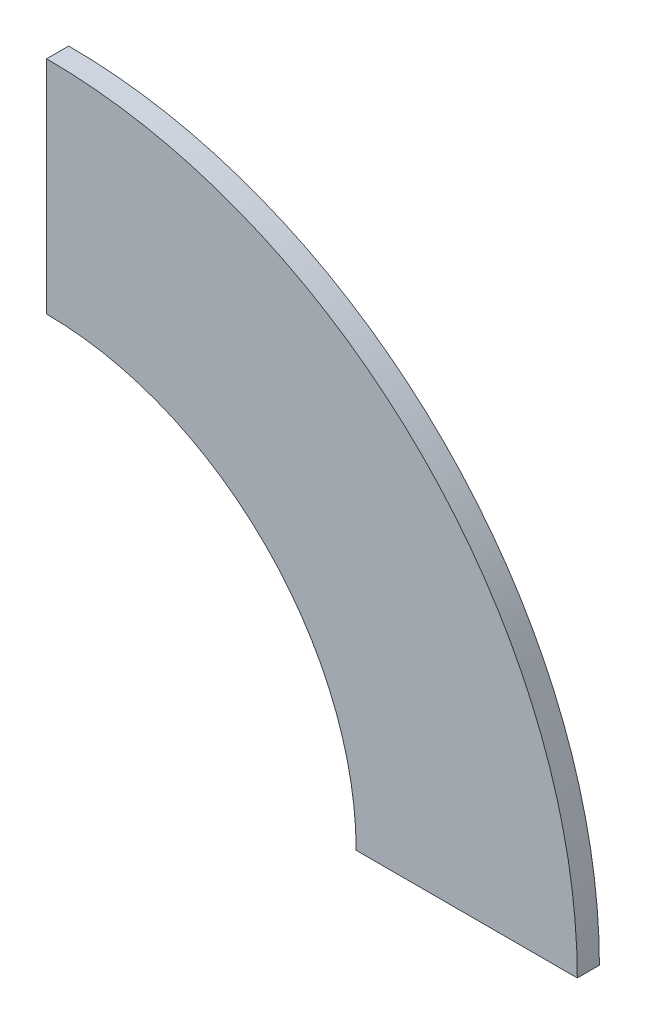
ISO-10303-21;
HEADER;
FILE_DESCRIPTION(('STEP AP214'),'2;1');
FILE_NAME('part.step','',(''),(''),'','','');
FILE_SCHEMA(('AUTOMOTIVE_DESIGN { 1 0 10303 214 1 1 1 1 }'));
ENDSEC;
DATA;
#1=APPLICATION_CONTEXT('core data for automotive mechanical design processes');
#2=APPLICATION_PROTOCOL_DEFINITION('international standard','automotive_design',2000,#1);
#3=PRODUCT_CONTEXT('',#1,'mechanical');
#4=PRODUCT('Part','Part','',(#3));
#5=PRODUCT_RELATED_PRODUCT_CATEGORY('part','',(#4));
#6=PRODUCT_DEFINITION_FORMATION('','',#4);
#7=PRODUCT_DEFINITION_CONTEXT('part definition',#1,'design');
#8=PRODUCT_DEFINITION('design','',#6,#7);
#9=PRODUCT_DEFINITION_SHAPE('','',#8);
#10=(LENGTH_UNIT() NAMED_UNIT(*) SI_UNIT(.MILLI.,.METRE.));
#11=(NAMED_UNIT(*) PLANE_ANGLE_UNIT() SI_UNIT($,.RADIAN.));
#12=(NAMED_UNIT(*) SI_UNIT($,.STERADIAN.) SOLID_ANGLE_UNIT());
#13=UNCERTAINTY_MEASURE_WITH_UNIT(LENGTH_MEASURE(1.E-05),#10,'distance_accuracy_value','');
#14=(GEOMETRIC_REPRESENTATION_CONTEXT(3) GLOBAL_UNCERTAINTY_ASSIGNED_CONTEXT((#13)) GLOBAL_UNIT_ASSIGNED_CONTEXT((#10,
#11,#12)) REPRESENTATION_CONTEXT('',''));
#15=CARTESIAN_POINT('',(0.,0.,0.));
#16=DIRECTION('',(0.,0.,1.));
#17=DIRECTION('',(1.,0.,0.));
#18=AXIS2_PLACEMENT_3D('',#15,#16,#17);
#19=CARTESIAN_POINT('',(700.,498.,19.99));
#20=DIRECTION('',(-1.,0.,0.));
#21=DIRECTION('',(0.,0.,1.));
#22=AXIS2_PLACEMENT_3D('',#19,#20,#21);
#23=PLANE('',#22);
#24=DIRECTION('',(0.,-1.,0.));
#25=VECTOR('',#24,1.);
#26=CARTESIAN_POINT('',(700.,480.,98.));
#27=LINE('',#26,#25);
#28=CARTESIAN_POINT('',(700.,498.,98.));
#29=VERTEX_POINT('',#28);
#30=CARTESIAN_POINT('',(700.,478.,98.));
#31=VERTEX_POINT('',#30);
#32=EDGE_CURVE('E99',#29,#31,#27,.T.);
#33=ORIENTED_EDGE('',*,*,#32,.T.);
#34=DIRECTION('',(0.,0.,1.));
#35=VECTOR('',#34,1.);
#36=CARTESIAN_POINT('',(700.,478.,20.));
#37=LINE('',#36,#35);
#38=CARTESIAN_POINT('',(700.,478.,100.));
#39=VERTEX_POINT('',#38);
#40=EDGE_CURVE('E11',#31,#39,#37,.T.);
#41=ORIENTED_EDGE('',*,*,#40,.T.);
#42=DIRECTION('',(0.,1.,0.));
#43=VECTOR('',#42,1.);
#44=CARTESIAN_POINT('',(700.,478.,100.));
#45=LINE('',#44,#43);
#46=CARTESIAN_POINT('',(700.,498.,100.));
#47=VERTEX_POINT('',#46);
#48=EDGE_CURVE('E48',#39,#47,#45,.T.);
#49=ORIENTED_EDGE('',*,*,#48,.T.);
#50=DIRECTION('',(0.,0.,1.));
#51=VECTOR('',#50,1.);
#52=CARTESIAN_POINT('',(700.,498.,-150.01));
#53=LINE('',#52,#51);
#54=EDGE_CURVE('E93',#29,#47,#53,.T.);
#55=ORIENTED_EDGE('',*,*,#54,.F.);
#56=EDGE_LOOP('',(#33,#41,#49,#55));
#57=FACE_BOUND('',#56,.T.);
#58=ADVANCED_FACE('F40',(#57),#23,.T.);
#59=CARTESIAN_POINT('',(728.,450.,19.99));
#60=DIRECTION('',(0.,-1.,0.));
#61=DIRECTION('',(0.,0.,-1.));
#62=AXIS2_PLACEMENT_3D('',#59,#60,#61);
#63=PLANE('',#62);
#64=DIRECTION('',(0.,0.,1.));
#65=VECTOR('',#64,1.);
#66=CARTESIAN_POINT('',(748.,450.,-150.01));
#67=LINE('',#66,#65);
#68=CARTESIAN_POINT('',(748.,450.,98.));
#69=VERTEX_POINT('',#68);
#70=CARTESIAN_POINT('',(748.,450.,100.));
#71=VERTEX_POINT('',#70);
#72=EDGE_CURVE('E87',#69,#71,#67,.T.);
#73=ORIENTED_EDGE('',*,*,#72,.T.);
#74=DIRECTION('',(1.,0.,0.));
#75=VECTOR('',#74,1.);
#76=CARTESIAN_POINT('',(728.,450.,100.));
#77=LINE('',#76,#75);
#78=CARTESIAN_POINT('',(728.,450.,100.));
#79=VERTEX_POINT('',#78);
#80=EDGE_CURVE('E103',#79,#71,#77,.T.);
#81=ORIENTED_EDGE('',*,*,#80,.F.);
#82=DIRECTION('',(0.,0.,1.));
#83=VECTOR('',#82,1.);
#84=CARTESIAN_POINT('',(728.,450.,20.));
#85=LINE('',#84,#83);
#86=CARTESIAN_POINT('',(728.,450.,98.));
#87=VERTEX_POINT('',#86);
#88=EDGE_CURVE('E88',#87,#79,#85,.T.);
#89=ORIENTED_EDGE('',*,*,#88,.F.);
#90=DIRECTION('',(-1.,0.,0.));
#91=VECTOR('',#90,1.);
#92=CARTESIAN_POINT('',(730.,450.,98.));
#93=LINE('',#92,#91);
#94=EDGE_CURVE('E84',#69,#87,#93,.T.);
#95=ORIENTED_EDGE('',*,*,#94,.F.);
#96=EDGE_LOOP('',(#73,#81,#89,#95));
#97=FACE_BOUND('',#96,.T.);
#98=ADVANCED_FACE('F86',(#97),#63,.T.);
#99=CARTESIAN_POINT('',(730.,450.,98.));
#100=DIRECTION('',(0.,0.,-1.));
#101=DIRECTION('',(-1.,0.,0.));
#102=AXIS2_PLACEMENT_3D('',#99,#100,#101);
#103=PLANE('',#102);
#104=ORIENTED_EDGE('',*,*,#94,.T.);
#105=CARTESIAN_POINT('',(700.,450.,98.));
#106=DIRECTION('',(0.,0.,-1.));
#107=DIRECTION('',(-1.,0.,0.));
#108=AXIS2_PLACEMENT_3D('',#105,#106,#107);
#109=CIRCLE('',#108,28.);
#110=EDGE_CURVE('E43',#31,#87,#109,.T.);
#111=ORIENTED_EDGE('',*,*,#110,.F.);
#112=ORIENTED_EDGE('',*,*,#32,.F.);
#113=CARTESIAN_POINT('',(700.,450.,98.));
#114=DIRECTION('',(0.,0.,1.));
#115=DIRECTION('',(1.,0.,0.));
#116=AXIS2_PLACEMENT_3D('',#113,#114,#115);
#117=CIRCLE('',#116,48.);
#118=EDGE_CURVE('E97',#69,#29,#117,.T.);
#119=ORIENTED_EDGE('',*,*,#118,.F.);
#120=EDGE_LOOP('',(#104,#111,#112,#119));
#121=FACE_BOUND('',#120,.T.);
#122=ADVANCED_FACE('F102',(#121),#103,.T.);
#123=CARTESIAN_POINT('',(728.,450.,100.));
#124=DIRECTION('',(0.,0.,1.));
#125=DIRECTION('',(1.,0.,0.));
#126=AXIS2_PLACEMENT_3D('',#123,#124,#125);
#127=PLANE('',#126);
#128=CARTESIAN_POINT('',(700.,450.,100.));
#129=DIRECTION('',(0.,0.,1.));
#130=DIRECTION('',(1.,0.,0.));
#131=AXIS2_PLACEMENT_3D('',#128,#129,#130);
#132=CIRCLE('',#131,48.);
#133=EDGE_CURVE('E63',#71,#47,#132,.T.);
#134=ORIENTED_EDGE('',*,*,#133,.T.);
#135=ORIENTED_EDGE('',*,*,#48,.F.);
#136=CARTESIAN_POINT('',(700.,450.,100.));
#137=DIRECTION('',(0.,0.,1.));
#138=DIRECTION('',(1.,0.,0.));
#139=AXIS2_PLACEMENT_3D('',#136,#137,#138);
#140=CIRCLE('',#139,28.);
#141=EDGE_CURVE('E56',#79,#39,#140,.T.);
#142=ORIENTED_EDGE('',*,*,#141,.F.);
#143=ORIENTED_EDGE('',*,*,#80,.T.);
#144=EDGE_LOOP('',(#134,#135,#142,#143));
#145=FACE_BOUND('',#144,.T.);
#146=ADVANCED_FACE('F119',(#145),#127,.T.);
#147=CARTESIAN_POINT('',(700.,450.,-150.01));
#148=DIRECTION('',(0.,0.,1.));
#149=DIRECTION('',(1.,0.,0.));
#150=AXIS2_PLACEMENT_3D('',#147,#148,#149);
#151=CYLINDRICAL_SURFACE('',#150,48.);
#152=ORIENTED_EDGE('',*,*,#72,.F.);
#153=ORIENTED_EDGE('',*,*,#118,.T.);
#154=ORIENTED_EDGE('',*,*,#54,.T.);
#155=ORIENTED_EDGE('',*,*,#133,.F.);
#156=EDGE_LOOP('',(#152,#153,#154,#155));
#157=FACE_BOUND('',#156,.T.);
#158=ADVANCED_FACE('F96',(#157),#151,.T.);
#159=CARTESIAN_POINT('',(700.,450.,448.));
#160=DIRECTION('',(0.,0.,1.));
#161=DIRECTION('',(1.,0.,0.));
#162=AXIS2_PLACEMENT_3D('',#159,#160,#161);
#163=CYLINDRICAL_SURFACE('',#162,28.);
#164=ORIENTED_EDGE('',*,*,#40,.F.);
#165=ORIENTED_EDGE('',*,*,#110,.T.);
#166=ORIENTED_EDGE('',*,*,#88,.T.);
#167=ORIENTED_EDGE('',*,*,#141,.T.);
#168=EDGE_LOOP('',(#164,#165,#166,#167));
#169=FACE_BOUND('',#168,.T.);
#170=ADVANCED_FACE('F113',(#169),#163,.F.);
#171=CLOSED_SHELL('',(#58,#98,#122,#146,#158,#170));
#172=MANIFOLD_SOLID_BREP('B2',#171);
#173=ADVANCED_BREP_SHAPE_REPRESENTATION('',(#18,#172),#14);
#174=SHAPE_DEFINITION_REPRESENTATION(#9,#173);
ENDSEC;
END-ISO-10303-21;
